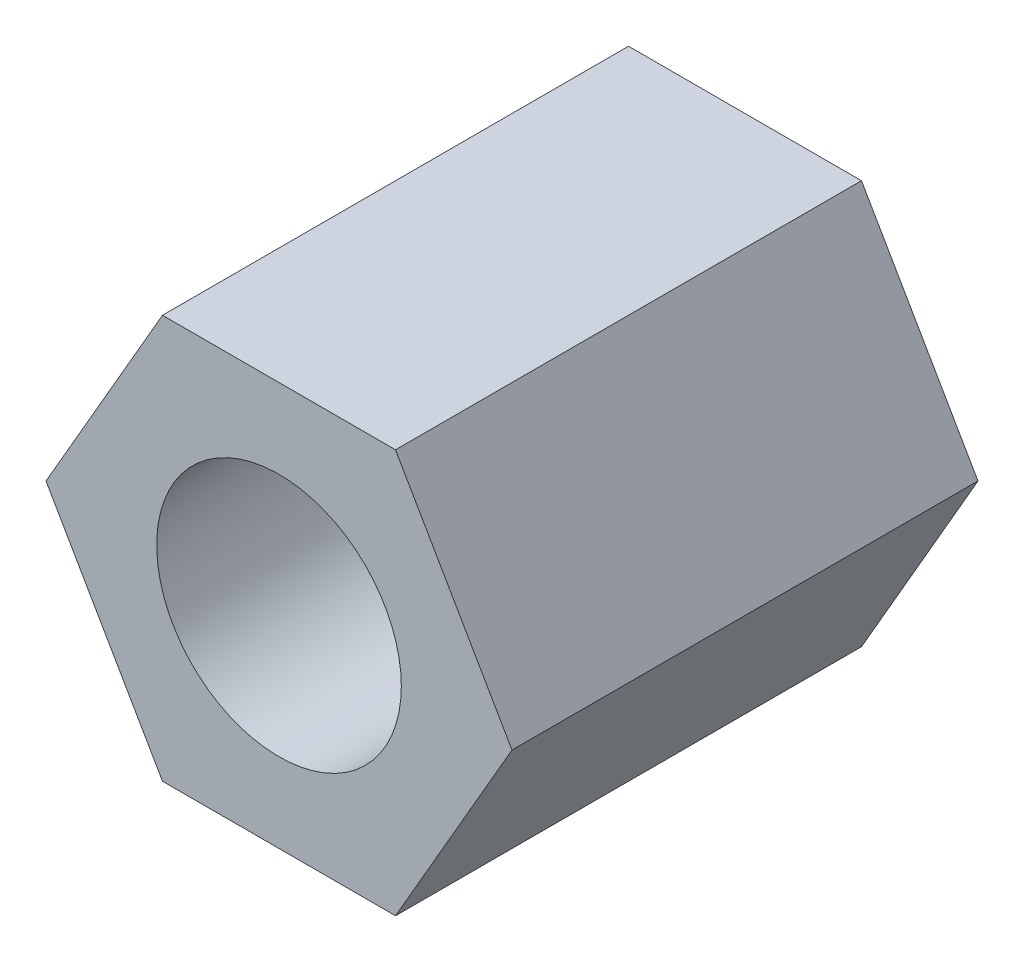
ISO-10303-21;
HEADER;
FILE_DESCRIPTION(('STEP AP214'),'2;1');
FILE_NAME('part.step','',(''),(''),'','','');
FILE_SCHEMA(('AUTOMOTIVE_DESIGN { 1 0 10303 214 1 1 1 1 }'));
ENDSEC;
DATA;
#1=APPLICATION_CONTEXT('core data for automotive mechanical design processes');
#2=APPLICATION_PROTOCOL_DEFINITION('international standard','automotive_design',2000,#1);
#3=PRODUCT_CONTEXT('',#1,'mechanical');
#4=PRODUCT('Part','Part','',(#3));
#5=PRODUCT_RELATED_PRODUCT_CATEGORY('part','',(#4));
#6=PRODUCT_DEFINITION_FORMATION('','',#4);
#7=PRODUCT_DEFINITION_CONTEXT('part definition',#1,'design');
#8=PRODUCT_DEFINITION('design','',#6,#7);
#9=PRODUCT_DEFINITION_SHAPE('','',#8);
#10=(LENGTH_UNIT() NAMED_UNIT(*) SI_UNIT(.MILLI.,.METRE.));
#11=(NAMED_UNIT(*) PLANE_ANGLE_UNIT() SI_UNIT($,.RADIAN.));
#12=(NAMED_UNIT(*) SI_UNIT($,.STERADIAN.) SOLID_ANGLE_UNIT());
#13=UNCERTAINTY_MEASURE_WITH_UNIT(LENGTH_MEASURE(1.E-05),#10,'distance_accuracy_value','');
#14=(GEOMETRIC_REPRESENTATION_CONTEXT(3) GLOBAL_UNCERTAINTY_ASSIGNED_CONTEXT((#13)) GLOBAL_UNIT_ASSIGNED_CONTEXT((#10,
#11,#12)) REPRESENTATION_CONTEXT('',''));
#15=CARTESIAN_POINT('',(0.,0.,0.));
#16=DIRECTION('',(0.,0.,1.));
#17=DIRECTION('',(1.,0.,0.));
#18=AXIS2_PLACEMENT_3D('',#15,#16,#17);
#19=CARTESIAN_POINT('',(0.,0.,0.));
#20=DIRECTION('',(0.,0.,-1.));
#21=DIRECTION('',(-1.,0.,0.));
#22=AXIS2_PLACEMENT_3D('',#19,#20,#21);
#23=PLANE('',#22);
#24=DIRECTION('',(-0.5,-0.866025403784439,0.));
#25=VECTOR('',#24,1.);
#26=CARTESIAN_POINT('',(-2.,-3.46410161513775,0.));
#27=LINE('',#26,#25);
#28=CARTESIAN_POINT('',(0.,0.,0.));
#29=VERTEX_POINT('',#28);
#30=CARTESIAN_POINT('',(-2.,-3.46410161513775,0.));
#31=VERTEX_POINT('',#30);
#32=EDGE_CURVE('E131',#29,#31,#27,.T.);
#33=ORIENTED_EDGE('',*,*,#32,.F.);
#34=DIRECTION('',(-1.,0.,0.));
#35=VECTOR('',#34,1.);
#36=CARTESIAN_POINT('',(0.,0.,0.));
#37=LINE('',#36,#35);
#38=CARTESIAN_POINT('',(4.,0.,0.));
#39=VERTEX_POINT('',#38);
#40=EDGE_CURVE('E88',#39,#29,#37,.T.);
#41=ORIENTED_EDGE('',*,*,#40,.F.);
#42=DIRECTION('',(-0.5,0.866025403784439,0.));
#43=VECTOR('',#42,1.);
#44=CARTESIAN_POINT('',(4.,0.,0.));
#45=LINE('',#44,#43);
#46=CARTESIAN_POINT('',(6.,-3.46410161513775,0.));
#47=VERTEX_POINT('',#46);
#48=EDGE_CURVE('E82',#47,#39,#45,.T.);
#49=ORIENTED_EDGE('',*,*,#48,.F.);
#50=DIRECTION('',(0.5,0.866025403784439,0.));
#51=VECTOR('',#50,1.);
#52=CARTESIAN_POINT('',(6.,-3.46410161513775,0.));
#53=LINE('',#52,#51);
#54=CARTESIAN_POINT('',(4.,-6.92820323027551,0.));
#55=VERTEX_POINT('',#54);
#56=EDGE_CURVE('E118',#55,#47,#53,.T.);
#57=ORIENTED_EDGE('',*,*,#56,.F.);
#58=DIRECTION('',(1.,0.,0.));
#59=VECTOR('',#58,1.);
#60=CARTESIAN_POINT('',(4.,-6.92820323027551,0.));
#61=LINE('',#60,#59);
#62=CARTESIAN_POINT('',(0.,-6.92820323027551,0.));
#63=VERTEX_POINT('',#62);
#64=EDGE_CURVE('E139',#63,#55,#61,.T.);
#65=ORIENTED_EDGE('',*,*,#64,.F.);
#66=DIRECTION('',(0.5,-0.866025403784439,0.));
#67=VECTOR('',#66,1.);
#68=CARTESIAN_POINT('',(0.,-6.92820323027551,0.));
#69=LINE('',#68,#67);
#70=EDGE_CURVE('E135',#31,#63,#69,.T.);
#71=ORIENTED_EDGE('',*,*,#70,.F.);
#72=EDGE_LOOP('',(#33,#41,#49,#57,#65,#71));
#73=FACE_BOUND('',#72,.T.);
#74=CARTESIAN_POINT('',(2.,-3.46410161513775,0.));
#75=DIRECTION('',(0.,0.,1.));
#76=DIRECTION('',(1.,0.,0.));
#77=AXIS2_PLACEMENT_3D('',#74,#75,#76);
#78=CIRCLE('',#77,2.1);
#79=CARTESIAN_POINT('',(4.1,-3.46410161513775,0.));
#80=VERTEX_POINT('',#79);
#81=EDGE_CURVE('E136',#80,#80,#78,.T.);
#82=ORIENTED_EDGE('',*,*,#81,.T.);
#83=EDGE_LOOP('',(#82));
#84=FACE_BOUND('',#83,.T.);
#85=ADVANCED_FACE('F41',(#73,#84),#23,.T.);
#86=CARTESIAN_POINT('',(-2.,-3.46410161513775,8.));
#87=DIRECTION('',(0.866025403784439,-0.5,0.));
#88=DIRECTION('',(0.5,0.866025403784439,0.));
#89=AXIS2_PLACEMENT_3D('',#86,#87,#88);
#90=PLANE('',#89);
#91=ORIENTED_EDGE('',*,*,#32,.T.);
#92=DIRECTION('',(0.,0.,-1.));
#93=VECTOR('',#92,1.);
#94=CARTESIAN_POINT('',(-2.,-3.46410161513775,8.));
#95=LINE('',#94,#93);
#96=CARTESIAN_POINT('',(-2.,-3.46410161513775,8.));
#97=VERTEX_POINT('',#96);
#98=EDGE_CURVE('E11',#97,#31,#95,.T.);
#99=ORIENTED_EDGE('',*,*,#98,.F.);
#100=DIRECTION('',(-0.5,-0.866025403784439,0.));
#101=VECTOR('',#100,1.);
#102=CARTESIAN_POINT('',(-2.,-3.46410161513775,8.));
#103=LINE('',#102,#101);
#104=CARTESIAN_POINT('',(0.,0.,8.));
#105=VERTEX_POINT('',#104);
#106=EDGE_CURVE('E148',#105,#97,#103,.T.);
#107=ORIENTED_EDGE('',*,*,#106,.F.);
#108=DIRECTION('',(0.,0.,-1.));
#109=VECTOR('',#108,1.);
#110=CARTESIAN_POINT('',(0.,0.,8.));
#111=LINE('',#110,#109);
#112=EDGE_CURVE('E127',#105,#29,#111,.T.);
#113=ORIENTED_EDGE('',*,*,#112,.T.);
#114=EDGE_LOOP('',(#91,#99,#107,#113));
#115=FACE_BOUND('',#114,.T.);
#116=ADVANCED_FACE('F43',(#115),#90,.F.);
#117=CARTESIAN_POINT('',(0.,-6.92820323027551,8.));
#118=DIRECTION('',(0.866025403784439,0.5,0.));
#119=DIRECTION('',(-0.5,0.866025403784439,0.));
#120=AXIS2_PLACEMENT_3D('',#117,#118,#119);
#121=PLANE('',#120);
#122=ORIENTED_EDGE('',*,*,#70,.T.);
#123=DIRECTION('',(0.,0.,-1.));
#124=VECTOR('',#123,1.);
#125=CARTESIAN_POINT('',(0.,-6.92820323027551,8.));
#126=LINE('',#125,#124);
#127=CARTESIAN_POINT('',(0.,-6.92820323027551,8.));
#128=VERTEX_POINT('',#127);
#129=EDGE_CURVE('E51',#128,#63,#126,.T.);
#130=ORIENTED_EDGE('',*,*,#129,.F.);
#131=DIRECTION('',(0.5,-0.866025403784439,0.));
#132=VECTOR('',#131,1.);
#133=CARTESIAN_POINT('',(0.,-6.92820323027551,8.));
#134=LINE('',#133,#132);
#135=EDGE_CURVE('E96',#97,#128,#134,.T.);
#136=ORIENTED_EDGE('',*,*,#135,.F.);
#137=ORIENTED_EDGE('',*,*,#98,.T.);
#138=EDGE_LOOP('',(#122,#130,#136,#137));
#139=FACE_BOUND('',#138,.T.);
#140=ADVANCED_FACE('F181',(#139),#121,.F.);
#141=CARTESIAN_POINT('',(4.,-6.92820323027551,8.));
#142=DIRECTION('',(0.,1.,0.));
#143=DIRECTION('',(0.,0.,1.));
#144=AXIS2_PLACEMENT_3D('',#141,#142,#143);
#145=PLANE('',#144);
#146=ORIENTED_EDGE('',*,*,#64,.T.);
#147=DIRECTION('',(0.,0.,-1.));
#148=VECTOR('',#147,1.);
#149=CARTESIAN_POINT('',(4.,-6.92820323027551,8.));
#150=LINE('',#149,#148);
#151=CARTESIAN_POINT('',(4.,-6.92820323027551,8.));
#152=VERTEX_POINT('',#151);
#153=EDGE_CURVE('E120',#152,#55,#150,.T.);
#154=ORIENTED_EDGE('',*,*,#153,.F.);
#155=DIRECTION('',(1.,0.,0.));
#156=VECTOR('',#155,1.);
#157=CARTESIAN_POINT('',(4.,-6.92820323027551,8.));
#158=LINE('',#157,#156);
#159=EDGE_CURVE('E109',#128,#152,#158,.T.);
#160=ORIENTED_EDGE('',*,*,#159,.F.);
#161=ORIENTED_EDGE('',*,*,#129,.T.);
#162=EDGE_LOOP('',(#146,#154,#160,#161));
#163=FACE_BOUND('',#162,.T.);
#164=ADVANCED_FACE('F158',(#163),#145,.F.);
#165=CARTESIAN_POINT('',(6.,-3.46410161513775,8.));
#166=DIRECTION('',(-0.866025403784439,0.5,0.));
#167=DIRECTION('',(-0.5,-0.866025403784439,0.));
#168=AXIS2_PLACEMENT_3D('',#165,#166,#167);
#169=PLANE('',#168);
#170=ORIENTED_EDGE('',*,*,#56,.T.);
#171=DIRECTION('',(0.,0.,-1.));
#172=VECTOR('',#171,1.);
#173=CARTESIAN_POINT('',(6.,-3.46410161513775,8.));
#174=LINE('',#173,#172);
#175=CARTESIAN_POINT('',(6.,-3.46410161513775,8.));
#176=VERTEX_POINT('',#175);
#177=EDGE_CURVE('E115',#176,#47,#174,.T.);
#178=ORIENTED_EDGE('',*,*,#177,.F.);
#179=DIRECTION('',(0.5,0.866025403784439,0.));
#180=VECTOR('',#179,1.);
#181=CARTESIAN_POINT('',(6.,-3.46410161513775,8.));
#182=LINE('',#181,#180);
#183=EDGE_CURVE('E103',#152,#176,#182,.T.);
#184=ORIENTED_EDGE('',*,*,#183,.F.);
#185=ORIENTED_EDGE('',*,*,#153,.T.);
#186=EDGE_LOOP('',(#170,#178,#184,#185));
#187=FACE_BOUND('',#186,.T.);
#188=ADVANCED_FACE('F116',(#187),#169,.F.);
#189=CARTESIAN_POINT('',(4.,0.,8.));
#190=DIRECTION('',(-0.866025403784439,-0.5,0.));
#191=DIRECTION('',(0.5,-0.866025403784439,0.));
#192=AXIS2_PLACEMENT_3D('',#189,#190,#191);
#193=PLANE('',#192);
#194=ORIENTED_EDGE('',*,*,#48,.T.);
#195=DIRECTION('',(0.,0.,-1.));
#196=VECTOR('',#195,1.);
#197=CARTESIAN_POINT('',(4.,0.,8.));
#198=LINE('',#197,#196);
#199=CARTESIAN_POINT('',(4.,0.,8.));
#200=VERTEX_POINT('',#199);
#201=EDGE_CURVE('E121',#200,#39,#198,.T.);
#202=ORIENTED_EDGE('',*,*,#201,.F.);
#203=DIRECTION('',(-0.5,0.866025403784439,0.));
#204=VECTOR('',#203,1.);
#205=CARTESIAN_POINT('',(4.,0.,8.));
#206=LINE('',#205,#204);
#207=EDGE_CURVE('E107',#176,#200,#206,.T.);
#208=ORIENTED_EDGE('',*,*,#207,.F.);
#209=ORIENTED_EDGE('',*,*,#177,.T.);
#210=EDGE_LOOP('',(#194,#202,#208,#209));
#211=FACE_BOUND('',#210,.T.);
#212=ADVANCED_FACE('F123',(#211),#193,.F.);
#213=CARTESIAN_POINT('',(0.,0.,8.));
#214=DIRECTION('',(0.,-1.,0.));
#215=DIRECTION('',(0.,0.,-1.));
#216=AXIS2_PLACEMENT_3D('',#213,#214,#215);
#217=PLANE('',#216);
#218=ORIENTED_EDGE('',*,*,#40,.T.);
#219=ORIENTED_EDGE('',*,*,#112,.F.);
#220=DIRECTION('',(-1.,0.,0.));
#221=VECTOR('',#220,1.);
#222=CARTESIAN_POINT('',(0.,0.,8.));
#223=LINE('',#222,#221);
#224=EDGE_CURVE('E59',#200,#105,#223,.T.);
#225=ORIENTED_EDGE('',*,*,#224,.F.);
#226=ORIENTED_EDGE('',*,*,#201,.T.);
#227=EDGE_LOOP('',(#218,#219,#225,#226));
#228=FACE_BOUND('',#227,.T.);
#229=ADVANCED_FACE('F165',(#228),#217,.F.);
#230=CARTESIAN_POINT('',(0.,0.,8.));
#231=DIRECTION('',(0.,0.,-1.));
#232=DIRECTION('',(-1.,0.,0.));
#233=AXIS2_PLACEMENT_3D('',#230,#231,#232);
#234=PLANE('',#233);
#235=CARTESIAN_POINT('',(2.,-3.46410161513775,8.));
#236=DIRECTION('',(0.,0.,1.));
#237=DIRECTION('',(1.,0.,0.));
#238=AXIS2_PLACEMENT_3D('',#235,#236,#237);
#239=CIRCLE('',#238,2.1);
#240=CARTESIAN_POINT('',(4.1,-3.46410161513775,8.));
#241=VERTEX_POINT('',#240);
#242=EDGE_CURVE('E192',#241,#241,#239,.T.);
#243=ORIENTED_EDGE('',*,*,#242,.F.);
#244=EDGE_LOOP('',(#243));
#245=FACE_BOUND('',#244,.T.);
#246=ORIENTED_EDGE('',*,*,#106,.T.);
#247=ORIENTED_EDGE('',*,*,#135,.T.);
#248=ORIENTED_EDGE('',*,*,#159,.T.);
#249=ORIENTED_EDGE('',*,*,#183,.T.);
#250=ORIENTED_EDGE('',*,*,#207,.T.);
#251=ORIENTED_EDGE('',*,*,#224,.T.);
#252=EDGE_LOOP('',(#246,#247,#248,#249,#250,#251));
#253=FACE_BOUND('',#252,.T.);
#254=ADVANCED_FACE('F105',(#245,#253),#234,.F.);
#255=CARTESIAN_POINT('',(2.,-3.46410161513775,8.));
#256=DIRECTION('',(0.,0.,1.));
#257=DIRECTION('',(1.,0.,0.));
#258=AXIS2_PLACEMENT_3D('',#255,#256,#257);
#259=CYLINDRICAL_SURFACE('',#258,2.1);
#260=ORIENTED_EDGE('',*,*,#81,.F.);
#261=EDGE_LOOP('',(#260));
#262=FACE_BOUND('',#261,.T.);
#263=ORIENTED_EDGE('',*,*,#242,.T.);
#264=EDGE_LOOP('',(#263));
#265=FACE_BOUND('',#264,.T.);
#266=ADVANCED_FACE('F172',(#262,#265),#259,.F.);
#267=CLOSED_SHELL('',(#85,#116,#140,#164,#188,#212,#229,#254,#266));
#268=MANIFOLD_SOLID_BREP('B2',#267);
#269=ADVANCED_BREP_SHAPE_REPRESENTATION('',(#18,#268),#14);
#270=SHAPE_DEFINITION_REPRESENTATION(#9,#269);
ENDSEC;
END-ISO-10303-21;
